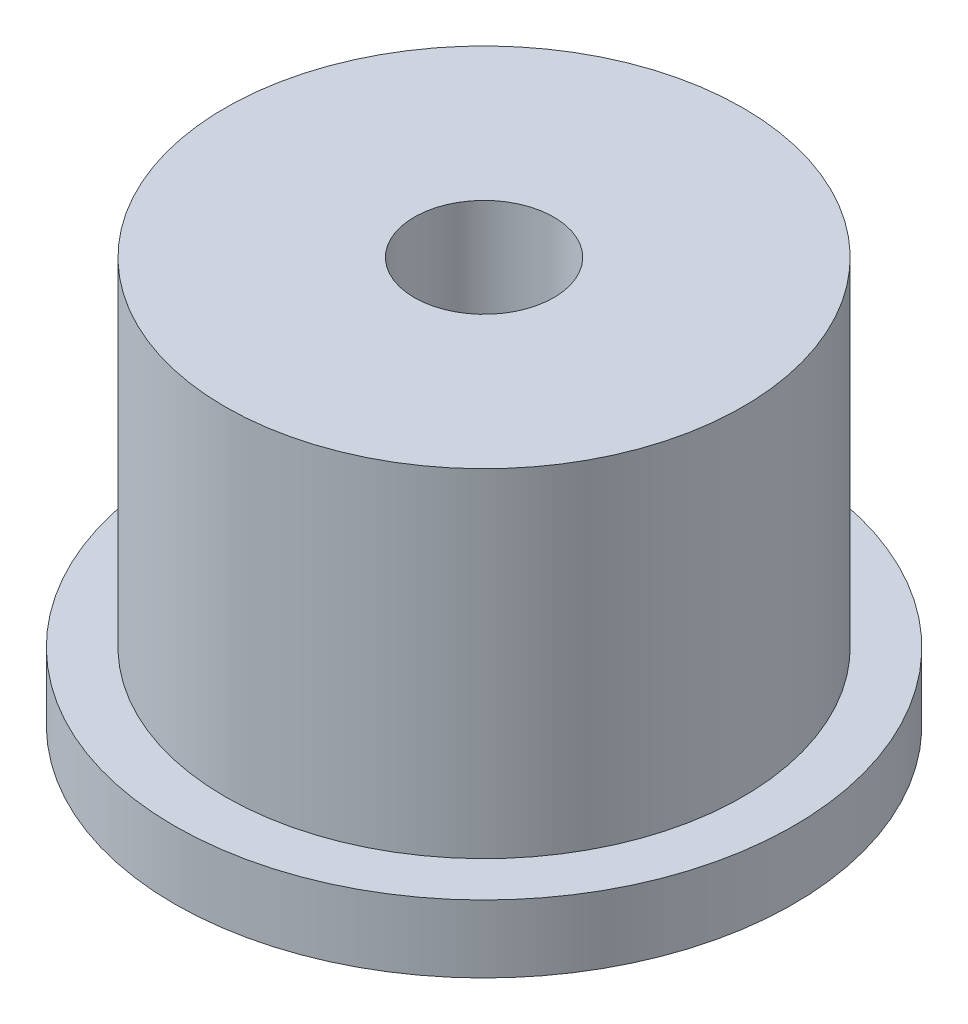
ISO-10303-21;
HEADER;
FILE_DESCRIPTION(('STEP AP214'),'2;1');
FILE_NAME('part.step','',(''),(''),'','','');
FILE_SCHEMA(('AUTOMOTIVE_DESIGN { 1 0 10303 214 1 1 1 1 }'));
ENDSEC;
DATA;
#1=APPLICATION_CONTEXT('core data for automotive mechanical design processes');
#2=APPLICATION_PROTOCOL_DEFINITION('international standard','automotive_design',2000,#1);
#3=PRODUCT_CONTEXT('',#1,'mechanical');
#4=PRODUCT('Part','Part','',(#3));
#5=PRODUCT_RELATED_PRODUCT_CATEGORY('part','',(#4));
#6=PRODUCT_DEFINITION_FORMATION('','',#4);
#7=PRODUCT_DEFINITION_CONTEXT('part definition',#1,'design');
#8=PRODUCT_DEFINITION('design','',#6,#7);
#9=PRODUCT_DEFINITION_SHAPE('','',#8);
#10=(LENGTH_UNIT() NAMED_UNIT(*) SI_UNIT(.MILLI.,.METRE.));
#11=(NAMED_UNIT(*) PLANE_ANGLE_UNIT() SI_UNIT($,.RADIAN.));
#12=(NAMED_UNIT(*) SI_UNIT($,.STERADIAN.) SOLID_ANGLE_UNIT());
#13=UNCERTAINTY_MEASURE_WITH_UNIT(LENGTH_MEASURE(1.E-05),#10,'distance_accuracy_value','');
#14=(GEOMETRIC_REPRESENTATION_CONTEXT(3) GLOBAL_UNCERTAINTY_ASSIGNED_CONTEXT((#13)) GLOBAL_UNIT_ASSIGNED_CONTEXT((#10,
#11,#12)) REPRESENTATION_CONTEXT('',''));
#15=CARTESIAN_POINT('',(0.,0.,0.));
#16=DIRECTION('',(0.,0.,1.));
#17=DIRECTION('',(1.,0.,0.));
#18=AXIS2_PLACEMENT_3D('',#15,#16,#17);
#19=CARTESIAN_POINT('',(0.,3.,0.));
#20=DIRECTION('',(0.,-1.,0.));
#21=DIRECTION('',(0.,0.,-1.));
#22=AXIS2_PLACEMENT_3D('',#19,#20,#21);
#23=CYLINDRICAL_SURFACE('',#22,13.75);
#24=CARTESIAN_POINT('',(0.,3.,0.));
#25=DIRECTION('',(0.,1.,0.));
#26=DIRECTION('',(0.,0.,1.));
#27=AXIS2_PLACEMENT_3D('',#24,#25,#26);
#28=CIRCLE('',#27,13.75);
#29=CARTESIAN_POINT('',(0.,3.,13.75));
#30=VERTEX_POINT('',#29);
#31=EDGE_CURVE('E10',#30,#30,#28,.T.);
#32=ORIENTED_EDGE('',*,*,#31,.F.);
#33=EDGE_LOOP('',(#32));
#34=FACE_BOUND('',#33,.T.);
#35=CARTESIAN_POINT('',(0.,0.,0.));
#36=DIRECTION('',(0.,1.,0.));
#37=DIRECTION('',(0.,0.,1.));
#38=AXIS2_PLACEMENT_3D('',#35,#36,#37);
#39=CIRCLE('',#38,13.75);
#40=CARTESIAN_POINT('',(0.,0.,13.75));
#41=VERTEX_POINT('',#40);
#42=EDGE_CURVE('E40',#41,#41,#39,.T.);
#43=ORIENTED_EDGE('',*,*,#42,.T.);
#44=EDGE_LOOP('',(#43));
#45=FACE_BOUND('',#44,.T.);
#46=ADVANCED_FACE('F37',(#34,#45),#23,.T.);
#47=CARTESIAN_POINT('',(0.,3.,0.));
#48=DIRECTION('',(0.,1.,0.));
#49=DIRECTION('',(0.,0.,1.));
#50=AXIS2_PLACEMENT_3D('',#47,#48,#49);
#51=PLANE('',#50);
#52=CARTESIAN_POINT('',(0.,3.,0.));
#53=DIRECTION('',(0.,1.,0.));
#54=DIRECTION('',(0.,0.,1.));
#55=AXIS2_PLACEMENT_3D('',#52,#53,#54);
#56=CIRCLE('',#55,11.5);
#57=CARTESIAN_POINT('',(0.,3.,11.5));
#58=VERTEX_POINT('',#57);
#59=EDGE_CURVE('E51',#58,#58,#56,.T.);
#60=ORIENTED_EDGE('',*,*,#59,.F.);
#61=EDGE_LOOP('',(#60));
#62=FACE_BOUND('',#61,.T.);
#63=ORIENTED_EDGE('',*,*,#31,.T.);
#64=EDGE_LOOP('',(#63));
#65=FACE_BOUND('',#64,.T.);
#66=ADVANCED_FACE('F88',(#62,#65),#51,.T.);
#67=CARTESIAN_POINT('',(0.,0.,0.));
#68=DIRECTION('',(0.,1.,0.));
#69=DIRECTION('',(0.,0.,1.));
#70=AXIS2_PLACEMENT_3D('',#67,#68,#69);
#71=PLANE('',#70);
#72=CARTESIAN_POINT('',(0.,0.,0.));
#73=DIRECTION('',(0.,1.,0.));
#74=DIRECTION('',(0.,0.,1.));
#75=AXIS2_PLACEMENT_3D('',#72,#73,#74);
#76=CIRCLE('',#75,3.1);
#77=CARTESIAN_POINT('',(0.,0.,3.1));
#78=VERTEX_POINT('',#77);
#79=EDGE_CURVE('E55',#78,#78,#76,.T.);
#80=ORIENTED_EDGE('',*,*,#79,.T.);
#81=EDGE_LOOP('',(#80));
#82=FACE_BOUND('',#81,.T.);
#83=ORIENTED_EDGE('',*,*,#42,.F.);
#84=EDGE_LOOP('',(#83));
#85=FACE_BOUND('',#84,.T.);
#86=ADVANCED_FACE('F67',(#82,#85),#71,.F.);
#87=CARTESIAN_POINT('',(0.,18.,0.));
#88=DIRECTION('',(0.,-1.,0.));
#89=DIRECTION('',(0.,0.,-1.));
#90=AXIS2_PLACEMENT_3D('',#87,#88,#89);
#91=CYLINDRICAL_SURFACE('',#90,11.5);
#92=CARTESIAN_POINT('',(0.,18.,0.));
#93=DIRECTION('',(0.,1.,0.));
#94=DIRECTION('',(0.,0.,1.));
#95=AXIS2_PLACEMENT_3D('',#92,#93,#94);
#96=CIRCLE('',#95,11.5);
#97=CARTESIAN_POINT('',(0.,18.,11.5));
#98=VERTEX_POINT('',#97);
#99=EDGE_CURVE('E49',#98,#98,#96,.T.);
#100=ORIENTED_EDGE('',*,*,#99,.F.);
#101=EDGE_LOOP('',(#100));
#102=FACE_BOUND('',#101,.T.);
#103=ORIENTED_EDGE('',*,*,#59,.T.);
#104=EDGE_LOOP('',(#103));
#105=FACE_BOUND('',#104,.T.);
#106=ADVANCED_FACE('F79',(#102,#105),#91,.T.);
#107=CARTESIAN_POINT('',(0.,18.,0.));
#108=DIRECTION('',(0.,1.,0.));
#109=DIRECTION('',(0.,0.,1.));
#110=AXIS2_PLACEMENT_3D('',#107,#108,#109);
#111=PLANE('',#110);
#112=CARTESIAN_POINT('',(0.,18.,0.));
#113=DIRECTION('',(0.,1.,0.));
#114=DIRECTION('',(0.,0.,1.));
#115=AXIS2_PLACEMENT_3D('',#112,#113,#114);
#116=CIRCLE('',#115,3.1);
#117=CARTESIAN_POINT('',(0.,18.,3.1));
#118=VERTEX_POINT('',#117);
#119=EDGE_CURVE('E59',#118,#118,#116,.T.);
#120=ORIENTED_EDGE('',*,*,#119,.F.);
#121=EDGE_LOOP('',(#120));
#122=FACE_BOUND('',#121,.T.);
#123=ORIENTED_EDGE('',*,*,#99,.T.);
#124=EDGE_LOOP('',(#123));
#125=FACE_BOUND('',#124,.T.);
#126=ADVANCED_FACE('F73',(#122,#125),#111,.T.);
#127=CARTESIAN_POINT('',(0.,0.,0.));
#128=DIRECTION('',(0.,1.,0.));
#129=DIRECTION('',(0.,0.,1.));
#130=AXIS2_PLACEMENT_3D('',#127,#128,#129);
#131=CYLINDRICAL_SURFACE('',#130,3.1);
#132=ORIENTED_EDGE('',*,*,#79,.F.);
#133=EDGE_LOOP('',(#132));
#134=FACE_BOUND('',#133,.T.);
#135=ORIENTED_EDGE('',*,*,#119,.T.);
#136=EDGE_LOOP('',(#135));
#137=FACE_BOUND('',#136,.T.);
#138=ADVANCED_FACE('F70',(#134,#137),#131,.F.);
#139=CLOSED_SHELL('',(#46,#66,#86,#106,#126,#138));
#140=MANIFOLD_SOLID_BREP('B2',#139);
#141=ADVANCED_BREP_SHAPE_REPRESENTATION('',(#18,#140),#14);
#142=SHAPE_DEFINITION_REPRESENTATION(#9,#141);
ENDSEC;
END-ISO-10303-21;
